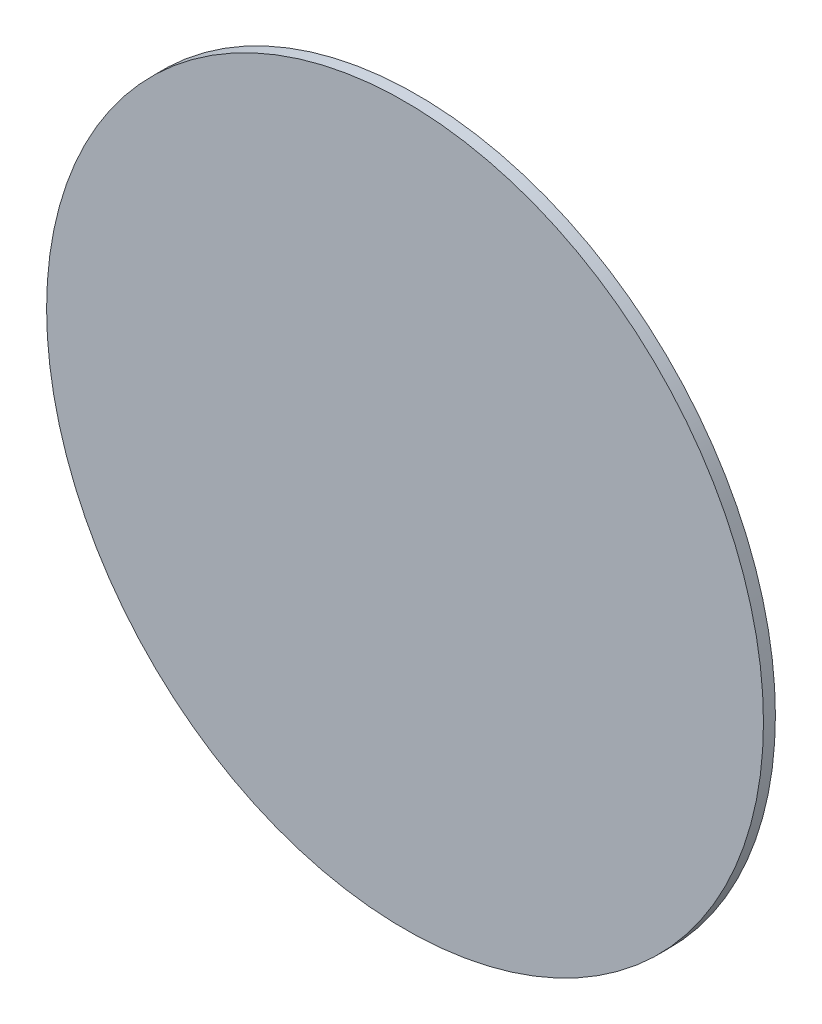
ISO-10303-21;
HEADER;
FILE_DESCRIPTION(('STEP AP214'),'2;1');
FILE_NAME('part.step','',(''),(''),'','','');
FILE_SCHEMA(('AUTOMOTIVE_DESIGN { 1 0 10303 214 1 1 1 1 }'));
ENDSEC;
DATA;
#1=APPLICATION_CONTEXT('core data for automotive mechanical design processes');
#2=APPLICATION_PROTOCOL_DEFINITION('international standard','automotive_design',2000,#1);
#3=PRODUCT_CONTEXT('',#1,'mechanical');
#4=PRODUCT('Part','Part','',(#3));
#5=PRODUCT_RELATED_PRODUCT_CATEGORY('part','',(#4));
#6=PRODUCT_DEFINITION_FORMATION('','',#4);
#7=PRODUCT_DEFINITION_CONTEXT('part definition',#1,'design');
#8=PRODUCT_DEFINITION('design','',#6,#7);
#9=PRODUCT_DEFINITION_SHAPE('','',#8);
#10=(LENGTH_UNIT() NAMED_UNIT(*) SI_UNIT(.MILLI.,.METRE.));
#11=(NAMED_UNIT(*) PLANE_ANGLE_UNIT() SI_UNIT($,.RADIAN.));
#12=(NAMED_UNIT(*) SI_UNIT($,.STERADIAN.) SOLID_ANGLE_UNIT());
#13=UNCERTAINTY_MEASURE_WITH_UNIT(LENGTH_MEASURE(1.E-05),#10,'distance_accuracy_value','');
#14=(GEOMETRIC_REPRESENTATION_CONTEXT(3) GLOBAL_UNCERTAINTY_ASSIGNED_CONTEXT((#13)) GLOBAL_UNIT_ASSIGNED_CONTEXT((#10,
#11,#12)) REPRESENTATION_CONTEXT('',''));
#15=CARTESIAN_POINT('',(0.,0.,0.));
#16=DIRECTION('',(0.,0.,1.));
#17=DIRECTION('',(1.,0.,0.));
#18=AXIS2_PLACEMENT_3D('',#15,#16,#17);
#19=CARTESIAN_POINT('',(16.0240092095592,22.154475414311,2.54));
#20=DIRECTION('',(0.,0.,-1.));
#21=DIRECTION('',(-1.,0.,0.));
#22=AXIS2_PLACEMENT_3D('',#19,#20,#21);
#23=CYLINDRICAL_SURFACE('',#22,76.2);
#24=CARTESIAN_POINT('',(16.0240092095592,22.154475414311,2.54));
#25=DIRECTION('',(0.,0.,1.));
#26=DIRECTION('',(1.,0.,0.));
#27=AXIS2_PLACEMENT_3D('',#24,#25,#26);
#28=CIRCLE('',#27,76.2);
#29=CARTESIAN_POINT('',(92.2240092095591,22.154475414311,2.54));
#30=VERTEX_POINT('',#29);
#31=EDGE_CURVE('E10',#30,#30,#28,.T.);
#32=ORIENTED_EDGE('',*,*,#31,.F.);
#33=EDGE_LOOP('',(#32));
#34=FACE_BOUND('',#33,.T.);
#35=CARTESIAN_POINT('',(16.0240092095592,22.154475414311,0.));
#36=DIRECTION('',(0.,0.,1.));
#37=DIRECTION('',(1.,0.,0.));
#38=AXIS2_PLACEMENT_3D('',#35,#36,#37);
#39=CIRCLE('',#38,76.2);
#40=CARTESIAN_POINT('',(92.2240092095591,22.154475414311,0.));
#41=VERTEX_POINT('',#40);
#42=EDGE_CURVE('E34',#41,#41,#39,.T.);
#43=ORIENTED_EDGE('',*,*,#42,.T.);
#44=EDGE_LOOP('',(#43));
#45=FACE_BOUND('',#44,.T.);
#46=ADVANCED_FACE('F31',(#34,#45),#23,.T.);
#47=CARTESIAN_POINT('',(16.0240092095592,22.154475414311,2.54));
#48=DIRECTION('',(0.,0.,1.));
#49=DIRECTION('',(1.,0.,0.));
#50=AXIS2_PLACEMENT_3D('',#47,#48,#49);
#51=PLANE('',#50);
#52=ORIENTED_EDGE('',*,*,#31,.T.);
#53=EDGE_LOOP('',(#52));
#54=FACE_BOUND('',#53,.T.);
#55=ADVANCED_FACE('F46',(#54),#51,.T.);
#56=CARTESIAN_POINT('',(16.0240092095592,22.154475414311,0.));
#57=DIRECTION('',(0.,0.,1.));
#58=DIRECTION('',(1.,0.,0.));
#59=AXIS2_PLACEMENT_3D('',#56,#57,#58);
#60=PLANE('',#59);
#61=ORIENTED_EDGE('',*,*,#42,.F.);
#62=EDGE_LOOP('',(#61));
#63=FACE_BOUND('',#62,.T.);
#64=ADVANCED_FACE('F44',(#63),#60,.F.);
#65=CLOSED_SHELL('',(#46,#55,#64));
#66=MANIFOLD_SOLID_BREP('B2',#65);
#67=ADVANCED_BREP_SHAPE_REPRESENTATION('',(#18,#66),#14);
#68=SHAPE_DEFINITION_REPRESENTATION(#9,#67);
ENDSEC;
END-ISO-10303-21;
